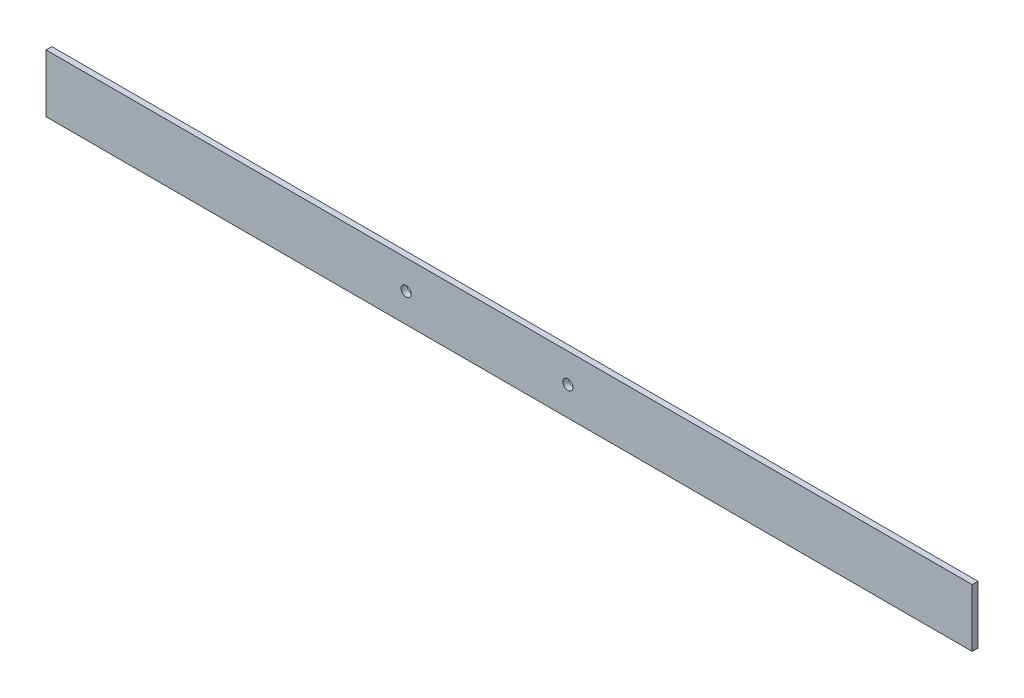
ISO-10303-21;
HEADER;
FILE_DESCRIPTION(('STEP AP214'),'2;1');
FILE_NAME('part.step','',(''),(''),'','','');
FILE_SCHEMA(('AUTOMOTIVE_DESIGN { 1 0 10303 214 1 1 1 1 }'));
ENDSEC;
DATA;
#1=APPLICATION_CONTEXT('core data for automotive mechanical design processes');
#2=APPLICATION_PROTOCOL_DEFINITION('international standard','automotive_design',2000,#1);
#3=PRODUCT_CONTEXT('',#1,'mechanical');
#4=PRODUCT('Part','Part','',(#3));
#5=PRODUCT_RELATED_PRODUCT_CATEGORY('part','',(#4));
#6=PRODUCT_DEFINITION_FORMATION('','',#4);
#7=PRODUCT_DEFINITION_CONTEXT('part definition',#1,'design');
#8=PRODUCT_DEFINITION('design','',#6,#7);
#9=PRODUCT_DEFINITION_SHAPE('','',#8);
#10=(LENGTH_UNIT() NAMED_UNIT(*) SI_UNIT(.MILLI.,.METRE.));
#11=(NAMED_UNIT(*) PLANE_ANGLE_UNIT() SI_UNIT($,.RADIAN.));
#12=(NAMED_UNIT(*) SI_UNIT($,.STERADIAN.) SOLID_ANGLE_UNIT());
#13=UNCERTAINTY_MEASURE_WITH_UNIT(LENGTH_MEASURE(1.E-05),#10,'distance_accuracy_value','');
#14=(GEOMETRIC_REPRESENTATION_CONTEXT(3) GLOBAL_UNCERTAINTY_ASSIGNED_CONTEXT((#13)) GLOBAL_UNIT_ASSIGNED_CONTEXT((#10,
#11,#12)) REPRESENTATION_CONTEXT('',''));
#15=CARTESIAN_POINT('',(0.,0.,0.));
#16=DIRECTION('',(0.,0.,1.));
#17=DIRECTION('',(1.,0.,0.));
#18=AXIS2_PLACEMENT_3D('',#15,#16,#17);
#19=CARTESIAN_POINT('',(0.,50.,5.));
#20=DIRECTION('',(0.,1.,0.));
#21=DIRECTION('',(0.,0.,1.));
#22=AXIS2_PLACEMENT_3D('',#19,#20,#21);
#23=PLANE('',#22);
#24=DIRECTION('',(1.,0.,0.));
#25=VECTOR('',#24,1.);
#26=CARTESIAN_POINT('',(0.,50.,0.));
#27=LINE('',#26,#25);
#28=CARTESIAN_POINT('',(0.,50.,0.));
#29=VERTEX_POINT('',#28);
#30=CARTESIAN_POINT('',(800.,50.,0.));
#31=VERTEX_POINT('',#30);
#32=EDGE_CURVE('E109',#29,#31,#27,.T.);
#33=ORIENTED_EDGE('',*,*,#32,.F.);
#34=DIRECTION('',(0.,0.,-1.));
#35=VECTOR('',#34,1.);
#36=CARTESIAN_POINT('',(0.,50.,5.));
#37=LINE('',#36,#35);
#38=CARTESIAN_POINT('',(0.,50.,5.));
#39=VERTEX_POINT('',#38);
#40=EDGE_CURVE('E11',#39,#29,#37,.T.);
#41=ORIENTED_EDGE('',*,*,#40,.F.);
#42=DIRECTION('',(1.,0.,0.));
#43=VECTOR('',#42,1.);
#44=CARTESIAN_POINT('',(0.,50.,5.));
#45=LINE('',#44,#43);
#46=CARTESIAN_POINT('',(800.,50.,5.));
#47=VERTEX_POINT('',#46);
#48=EDGE_CURVE('E96',#39,#47,#45,.T.);
#49=ORIENTED_EDGE('',*,*,#48,.T.);
#50=DIRECTION('',(0.,0.,-1.));
#51=VECTOR('',#50,1.);
#52=CARTESIAN_POINT('',(800.,50.,5.));
#53=LINE('',#52,#51);
#54=EDGE_CURVE('E74',#47,#31,#53,.T.);
#55=ORIENTED_EDGE('',*,*,#54,.T.);
#56=EDGE_LOOP('',(#33,#41,#49,#55));
#57=FACE_BOUND('',#56,.T.);
#58=ADVANCED_FACE('F34',(#57),#23,.T.);
#59=CARTESIAN_POINT('',(0.,0.,5.));
#60=DIRECTION('',(-1.,0.,0.));
#61=DIRECTION('',(0.,0.,1.));
#62=AXIS2_PLACEMENT_3D('',#59,#60,#61);
#63=PLANE('',#62);
#64=DIRECTION('',(0.,1.,0.));
#65=VECTOR('',#64,1.);
#66=CARTESIAN_POINT('',(0.,0.,0.));
#67=LINE('',#66,#65);
#68=CARTESIAN_POINT('',(0.,0.,0.));
#69=VERTEX_POINT('',#68);
#70=EDGE_CURVE('E86',#69,#29,#67,.T.);
#71=ORIENTED_EDGE('',*,*,#70,.F.);
#72=DIRECTION('',(0.,0.,-1.));
#73=VECTOR('',#72,1.);
#74=CARTESIAN_POINT('',(0.,0.,5.));
#75=LINE('',#74,#73);
#76=CARTESIAN_POINT('',(0.,0.,5.));
#77=VERTEX_POINT('',#76);
#78=EDGE_CURVE('E43',#77,#69,#75,.T.);
#79=ORIENTED_EDGE('',*,*,#78,.F.);
#80=DIRECTION('',(0.,1.,0.));
#81=VECTOR('',#80,1.);
#82=CARTESIAN_POINT('',(0.,0.,5.));
#83=LINE('',#82,#81);
#84=EDGE_CURVE('E84',#77,#39,#83,.T.);
#85=ORIENTED_EDGE('',*,*,#84,.T.);
#86=ORIENTED_EDGE('',*,*,#40,.T.);
#87=EDGE_LOOP('',(#71,#79,#85,#86));
#88=FACE_BOUND('',#87,.T.);
#89=ADVANCED_FACE('F82',(#88),#63,.T.);
#90=CARTESIAN_POINT('',(0.,0.,5.));
#91=DIRECTION('',(0.,1.,0.));
#92=DIRECTION('',(0.,0.,1.));
#93=AXIS2_PLACEMENT_3D('',#90,#91,#92);
#94=PLANE('',#93);
#95=DIRECTION('',(1.,0.,0.));
#96=VECTOR('',#95,1.);
#97=CARTESIAN_POINT('',(0.,0.,0.));
#98=LINE('',#97,#96);
#99=CARTESIAN_POINT('',(800.,0.,0.));
#100=VERTEX_POINT('',#99);
#101=EDGE_CURVE('E112',#69,#100,#98,.T.);
#102=ORIENTED_EDGE('',*,*,#101,.T.);
#103=DIRECTION('',(0.,0.,-1.));
#104=VECTOR('',#103,1.);
#105=CARTESIAN_POINT('',(800.,0.,5.));
#106=LINE('',#105,#104);
#107=CARTESIAN_POINT('',(800.,0.,5.));
#108=VERTEX_POINT('',#107);
#109=EDGE_CURVE('E89',#108,#100,#106,.T.);
#110=ORIENTED_EDGE('',*,*,#109,.F.);
#111=DIRECTION('',(1.,0.,0.));
#112=VECTOR('',#111,1.);
#113=CARTESIAN_POINT('',(0.,0.,5.));
#114=LINE('',#113,#112);
#115=EDGE_CURVE('E91',#77,#108,#114,.T.);
#116=ORIENTED_EDGE('',*,*,#115,.F.);
#117=ORIENTED_EDGE('',*,*,#78,.T.);
#118=EDGE_LOOP('',(#102,#110,#116,#117));
#119=FACE_BOUND('',#118,.T.);
#120=ADVANCED_FACE('F92',(#119),#94,.F.);
#121=CARTESIAN_POINT('',(800.,0.,5.));
#122=DIRECTION('',(-1.,0.,0.));
#123=DIRECTION('',(0.,0.,1.));
#124=AXIS2_PLACEMENT_3D('',#121,#122,#123);
#125=PLANE('',#124);
#126=DIRECTION('',(0.,1.,0.));
#127=VECTOR('',#126,1.);
#128=CARTESIAN_POINT('',(800.,0.,0.));
#129=LINE('',#128,#127);
#130=EDGE_CURVE('E67',#100,#31,#129,.T.);
#131=ORIENTED_EDGE('',*,*,#130,.T.);
#132=ORIENTED_EDGE('',*,*,#54,.F.);
#133=DIRECTION('',(0.,1.,0.));
#134=VECTOR('',#133,1.);
#135=CARTESIAN_POINT('',(800.,0.,5.));
#136=LINE('',#135,#134);
#137=EDGE_CURVE('E51',#108,#47,#136,.T.);
#138=ORIENTED_EDGE('',*,*,#137,.F.);
#139=ORIENTED_EDGE('',*,*,#109,.T.);
#140=EDGE_LOOP('',(#131,#132,#138,#139));
#141=FACE_BOUND('',#140,.T.);
#142=ADVANCED_FACE('F120',(#141),#125,.F.);
#143=CARTESIAN_POINT('',(311.100000000001,25.,5.));
#144=DIRECTION('',(0.,0.,-1.));
#145=DIRECTION('',(-1.,0.,0.));
#146=AXIS2_PLACEMENT_3D('',#143,#144,#145);
#147=CYLINDRICAL_SURFACE('',#146,4.36500000000003);
#148=CARTESIAN_POINT('',(311.100000000001,25.,5.));
#149=DIRECTION('',(0.,0.,1.));
#150=DIRECTION('',(1.,0.,0.));
#151=AXIS2_PLACEMENT_3D('',#148,#149,#150);
#152=CIRCLE('',#151,4.36500000000003);
#153=CARTESIAN_POINT('',(315.465000000001,25.,5.));
#154=VERTEX_POINT('',#153);
#155=EDGE_CURVE('E98',#154,#154,#152,.T.);
#156=ORIENTED_EDGE('',*,*,#155,.T.);
#157=EDGE_LOOP('',(#156));
#158=FACE_BOUND('',#157,.T.);
#159=CARTESIAN_POINT('',(311.100000000001,25.,0.));
#160=DIRECTION('',(0.,0.,1.));
#161=DIRECTION('',(1.,0.,0.));
#162=AXIS2_PLACEMENT_3D('',#159,#160,#161);
#163=CIRCLE('',#162,4.36500000000003);
#164=CARTESIAN_POINT('',(315.465000000001,25.,0.));
#165=VERTEX_POINT('',#164);
#166=EDGE_CURVE('E106',#165,#165,#163,.T.);
#167=ORIENTED_EDGE('',*,*,#166,.F.);
#168=EDGE_LOOP('',(#167));
#169=FACE_BOUND('',#168,.T.);
#170=ADVANCED_FACE('F36',(#158,#169),#147,.F.);
#171=CARTESIAN_POINT('',(450.8,25.,5.));
#172=DIRECTION('',(0.,0.,-1.));
#173=DIRECTION('',(-1.,0.,0.));
#174=AXIS2_PLACEMENT_3D('',#171,#172,#173);
#175=CYLINDRICAL_SURFACE('',#174,4.36500000000003);
#176=CARTESIAN_POINT('',(450.8,25.,5.));
#177=DIRECTION('',(0.,0.,1.));
#178=DIRECTION('',(1.,0.,0.));
#179=AXIS2_PLACEMENT_3D('',#176,#177,#178);
#180=CIRCLE('',#179,4.36500000000003);
#181=CARTESIAN_POINT('',(455.165,25.,5.));
#182=VERTEX_POINT('',#181);
#183=EDGE_CURVE('E103',#182,#182,#180,.T.);
#184=ORIENTED_EDGE('',*,*,#183,.T.);
#185=EDGE_LOOP('',(#184));
#186=FACE_BOUND('',#185,.T.);
#187=CARTESIAN_POINT('',(450.8,25.,0.));
#188=DIRECTION('',(0.,0.,1.));
#189=DIRECTION('',(1.,0.,0.));
#190=AXIS2_PLACEMENT_3D('',#187,#188,#189);
#191=CIRCLE('',#190,4.36500000000003);
#192=CARTESIAN_POINT('',(455.165,25.,0.));
#193=VERTEX_POINT('',#192);
#194=EDGE_CURVE('E115',#193,#193,#191,.T.);
#195=ORIENTED_EDGE('',*,*,#194,.F.);
#196=EDGE_LOOP('',(#195));
#197=FACE_BOUND('',#196,.T.);
#198=ADVANCED_FACE('F133',(#186,#197),#175,.F.);
#199=CARTESIAN_POINT('',(0.,0.,5.));
#200=DIRECTION('',(0.,0.,1.));
#201=DIRECTION('',(1.,0.,0.));
#202=AXIS2_PLACEMENT_3D('',#199,#200,#201);
#203=PLANE('',#202);
#204=ORIENTED_EDGE('',*,*,#155,.F.);
#205=EDGE_LOOP('',(#204));
#206=FACE_BOUND('',#205,.T.);
#207=ORIENTED_EDGE('',*,*,#48,.F.);
#208=ORIENTED_EDGE('',*,*,#84,.F.);
#209=ORIENTED_EDGE('',*,*,#115,.T.);
#210=ORIENTED_EDGE('',*,*,#137,.T.);
#211=EDGE_LOOP('',(#207,#208,#209,#210));
#212=FACE_BOUND('',#211,.T.);
#213=ORIENTED_EDGE('',*,*,#183,.F.);
#214=EDGE_LOOP('',(#213));
#215=FACE_BOUND('',#214,.T.);
#216=ADVANCED_FACE('F94',(#206,#212,#215),#203,.T.);
#217=CARTESIAN_POINT('',(0.,0.,0.));
#218=DIRECTION('',(0.,0.,1.));
#219=DIRECTION('',(1.,0.,0.));
#220=AXIS2_PLACEMENT_3D('',#217,#218,#219);
#221=PLANE('',#220);
#222=ORIENTED_EDGE('',*,*,#166,.T.);
#223=EDGE_LOOP('',(#222));
#224=FACE_BOUND('',#223,.T.);
#225=ORIENTED_EDGE('',*,*,#32,.T.);
#226=ORIENTED_EDGE('',*,*,#130,.F.);
#227=ORIENTED_EDGE('',*,*,#101,.F.);
#228=ORIENTED_EDGE('',*,*,#70,.T.);
#229=EDGE_LOOP('',(#225,#226,#227,#228));
#230=FACE_BOUND('',#229,.T.);
#231=ORIENTED_EDGE('',*,*,#194,.T.);
#232=EDGE_LOOP('',(#231));
#233=FACE_BOUND('',#232,.T.);
#234=ADVANCED_FACE('F121',(#224,#230,#233),#221,.F.);
#235=CLOSED_SHELL('',(#58,#89,#120,#142,#170,#198,#216,#234));
#236=MANIFOLD_SOLID_BREP('B2',#235);
#237=ADVANCED_BREP_SHAPE_REPRESENTATION('',(#18,#236),#14);
#238=SHAPE_DEFINITION_REPRESENTATION(#9,#237);
ENDSEC;
END-ISO-10303-21;
